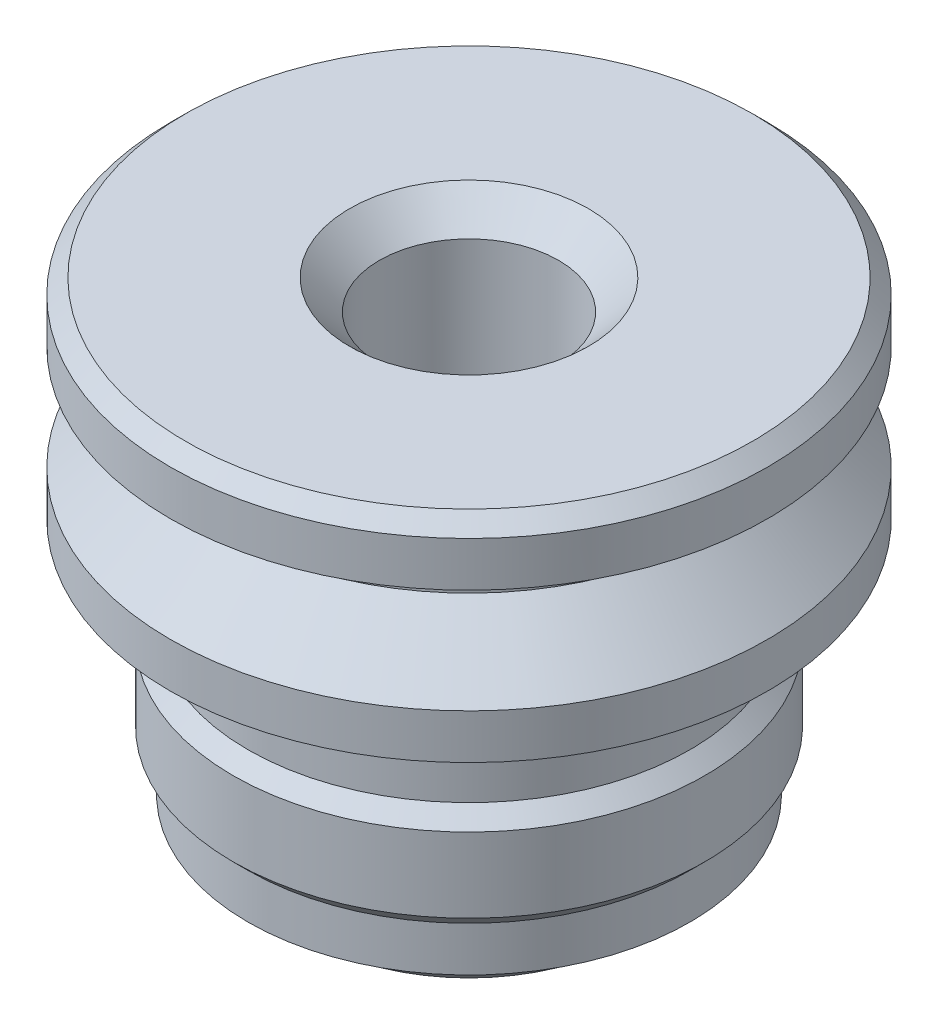
ISO-10303-21;
HEADER;
FILE_DESCRIPTION(('STEP AP214'),'2;1');
FILE_NAME('part.step','',(''),(''),'','','');
FILE_SCHEMA(('AUTOMOTIVE_DESIGN { 1 0 10303 214 1 1 1 1 }'));
ENDSEC;
DATA;
#1=APPLICATION_CONTEXT('core data for automotive mechanical design processes');
#2=APPLICATION_PROTOCOL_DEFINITION('international standard','automotive_design',2000,#1);
#3=PRODUCT_CONTEXT('',#1,'mechanical');
#4=PRODUCT('Part','Part','',(#3));
#5=PRODUCT_RELATED_PRODUCT_CATEGORY('part','',(#4));
#6=PRODUCT_DEFINITION_FORMATION('','',#4);
#7=PRODUCT_DEFINITION_CONTEXT('part definition',#1,'design');
#8=PRODUCT_DEFINITION('design','',#6,#7);
#9=PRODUCT_DEFINITION_SHAPE('','',#8);
#10=(LENGTH_UNIT() NAMED_UNIT(*) SI_UNIT(.MILLI.,.METRE.));
#11=(NAMED_UNIT(*) PLANE_ANGLE_UNIT() SI_UNIT($,.RADIAN.));
#12=(NAMED_UNIT(*) SI_UNIT($,.STERADIAN.) SOLID_ANGLE_UNIT());
#13=UNCERTAINTY_MEASURE_WITH_UNIT(LENGTH_MEASURE(1.E-05),#10,'distance_accuracy_value','');
#14=(GEOMETRIC_REPRESENTATION_CONTEXT(3) GLOBAL_UNCERTAINTY_ASSIGNED_CONTEXT((#13)) GLOBAL_UNIT_ASSIGNED_CONTEXT((#10,
#11,#12)) REPRESENTATION_CONTEXT('',''));
#15=CARTESIAN_POINT('',(0.,0.,0.));
#16=DIRECTION('',(0.,0.,1.));
#17=DIRECTION('',(1.,0.,0.));
#18=AXIS2_PLACEMENT_3D('',#15,#16,#17);
#19=CARTESIAN_POINT('',(0.,0.,0.));
#20=DIRECTION('',(0.,1.,0.));
#21=DIRECTION('',(0.,0.,1.));
#22=AXIS2_PLACEMENT_3D('',#19,#20,#21);
#23=CYLINDRICAL_SURFACE('',#22,10.);
#24=CARTESIAN_POINT('',(0.,-0.500000000000002,0.));
#25=DIRECTION('',(0.,-1.,0.));
#26=DIRECTION('',(0.,0.,-1.));
#27=AXIS2_PLACEMENT_3D('',#24,#25,#26);
#28=CIRCLE('',#27,10.);
#29=CARTESIAN_POINT('',(0.,-0.500000000000002,-10.));
#30=VERTEX_POINT('',#29);
#31=EDGE_CURVE('E42',#30,#30,#28,.T.);
#32=ORIENTED_EDGE('',*,*,#31,.T.);
#33=EDGE_LOOP('',(#32));
#34=FACE_BOUND('',#33,.T.);
#35=CARTESIAN_POINT('',(0.,-2.,0.));
#36=DIRECTION('',(0.,1.,0.));
#37=DIRECTION('',(0.,0.,1.));
#38=AXIS2_PLACEMENT_3D('',#35,#36,#37);
#39=CIRCLE('',#38,10.);
#40=CARTESIAN_POINT('',(0.,-2.,10.));
#41=VERTEX_POINT('',#40);
#42=EDGE_CURVE('E57',#41,#41,#39,.T.);
#43=ORIENTED_EDGE('',*,*,#42,.T.);
#44=EDGE_LOOP('',(#43));
#45=FACE_BOUND('',#44,.T.);
#46=ADVANCED_FACE('F31',(#34,#45),#23,.T.);
#47=CARTESIAN_POINT('',(0.,-2.,-10.));
#48=DIRECTION('',(0.,1.,0.));
#49=DIRECTION('',(0.,0.,1.));
#50=AXIS2_PLACEMENT_3D('',#47,#48,#49);
#51=PLANE('',#50);
#52=ORIENTED_EDGE('',*,*,#42,.F.);
#53=EDGE_LOOP('',(#52));
#54=FACE_BOUND('',#53,.T.);
#55=CARTESIAN_POINT('',(0.,-2.,0.));
#56=DIRECTION('',(0.,1.,0.));
#57=DIRECTION('',(0.,0.,1.));
#58=AXIS2_PLACEMENT_3D('',#55,#56,#57);
#59=CIRCLE('',#58,8.);
#60=CARTESIAN_POINT('',(0.,-2.,8.));
#61=VERTEX_POINT('',#60);
#62=EDGE_CURVE('E60',#61,#61,#59,.T.);
#63=ORIENTED_EDGE('',*,*,#62,.T.);
#64=EDGE_LOOP('',(#63));
#65=FACE_BOUND('',#64,.T.);
#66=ADVANCED_FACE('F113',(#54,#65),#51,.F.);
#67=CARTESIAN_POINT('',(0.,0.,0.));
#68=DIRECTION('',(0.,1.,0.));
#69=DIRECTION('',(0.,0.,1.));
#70=AXIS2_PLACEMENT_3D('',#67,#68,#69);
#71=CYLINDRICAL_SURFACE('',#70,8.);
#72=ORIENTED_EDGE('',*,*,#62,.F.);
#73=EDGE_LOOP('',(#72));
#74=FACE_BOUND('',#73,.T.);
#75=CARTESIAN_POINT('',(0.,-3.5,0.));
#76=DIRECTION('',(0.,1.,0.));
#77=DIRECTION('',(0.,0.,1.));
#78=AXIS2_PLACEMENT_3D('',#75,#76,#77);
#79=CIRCLE('',#78,8.);
#80=CARTESIAN_POINT('',(0.,-3.5,8.));
#81=VERTEX_POINT('',#80);
#82=EDGE_CURVE('E63',#81,#81,#79,.T.);
#83=ORIENTED_EDGE('',*,*,#82,.T.);
#84=EDGE_LOOP('',(#83));
#85=FACE_BOUND('',#84,.T.);
#86=ADVANCED_FACE('F119',(#74,#85),#71,.T.);
#87=CARTESIAN_POINT('',(0.,-5.5,0.));
#88=DIRECTION('',(0.,-1.,0.));
#89=DIRECTION('',(0.,0.,-1.));
#90=AXIS2_PLACEMENT_3D('',#87,#88,#89);
#91=CONICAL_SURFACE('',#90,10.,0.785398163397448);
#92=ORIENTED_EDGE('',*,*,#82,.F.);
#93=EDGE_LOOP('',(#92));
#94=FACE_BOUND('',#93,.T.);
#95=CARTESIAN_POINT('',(0.,-5.5,0.));
#96=DIRECTION('',(0.,1.,0.));
#97=DIRECTION('',(0.,0.,1.));
#98=AXIS2_PLACEMENT_3D('',#95,#96,#97);
#99=CIRCLE('',#98,10.);
#100=CARTESIAN_POINT('',(0.,-5.5,10.));
#101=VERTEX_POINT('',#100);
#102=EDGE_CURVE('E66',#101,#101,#99,.T.);
#103=ORIENTED_EDGE('',*,*,#102,.T.);
#104=EDGE_LOOP('',(#103));
#105=FACE_BOUND('',#104,.T.);
#106=ADVANCED_FACE('F261',(#94,#105),#91,.T.);
#107=CARTESIAN_POINT('',(0.,0.,0.));
#108=DIRECTION('',(0.,1.,0.));
#109=DIRECTION('',(0.,0.,1.));
#110=AXIS2_PLACEMENT_3D('',#107,#108,#109);
#111=CYLINDRICAL_SURFACE('',#110,10.);
#112=ORIENTED_EDGE('',*,*,#102,.F.);
#113=EDGE_LOOP('',(#112));
#114=FACE_BOUND('',#113,.T.);
#115=CARTESIAN_POINT('',(0.,-7.,0.));
#116=DIRECTION('',(0.,1.,0.));
#117=DIRECTION('',(0.,0.,1.));
#118=AXIS2_PLACEMENT_3D('',#115,#116,#117);
#119=CIRCLE('',#118,10.);
#120=CARTESIAN_POINT('',(0.,-7.,10.));
#121=VERTEX_POINT('',#120);
#122=EDGE_CURVE('E69',#121,#121,#119,.T.);
#123=ORIENTED_EDGE('',*,*,#122,.T.);
#124=EDGE_LOOP('',(#123));
#125=FACE_BOUND('',#124,.T.);
#126=ADVANCED_FACE('F251',(#114,#125),#111,.T.);
#127=CARTESIAN_POINT('',(0.,-7.,-10.));
#128=DIRECTION('',(0.,1.,0.));
#129=DIRECTION('',(0.,0.,1.));
#130=AXIS2_PLACEMENT_3D('',#127,#128,#129);
#131=PLANE('',#130);
#132=ORIENTED_EDGE('',*,*,#122,.F.);
#133=EDGE_LOOP('',(#132));
#134=FACE_BOUND('',#133,.T.);
#135=CARTESIAN_POINT('',(0.,-7.,0.));
#136=DIRECTION('',(0.,1.,0.));
#137=DIRECTION('',(0.,0.,1.));
#138=AXIS2_PLACEMENT_3D('',#135,#136,#137);
#139=CIRCLE('',#138,7.4);
#140=CARTESIAN_POINT('',(0.,-7.,7.4));
#141=VERTEX_POINT('',#140);
#142=EDGE_CURVE('E72',#141,#141,#139,.T.);
#143=ORIENTED_EDGE('',*,*,#142,.T.);
#144=EDGE_LOOP('',(#143));
#145=FACE_BOUND('',#144,.T.);
#146=ADVANCED_FACE('F241',(#134,#145),#131,.F.);
#147=CARTESIAN_POINT('',(0.,0.,0.));
#148=DIRECTION('',(0.,1.,0.));
#149=DIRECTION('',(0.,0.,1.));
#150=AXIS2_PLACEMENT_3D('',#147,#148,#149);
#151=CYLINDRICAL_SURFACE('',#150,7.4);
#152=ORIENTED_EDGE('',*,*,#142,.F.);
#153=EDGE_LOOP('',(#152));
#154=FACE_BOUND('',#153,.T.);
#155=CARTESIAN_POINT('',(0.,-10.,0.));
#156=DIRECTION('',(0.,1.,0.));
#157=DIRECTION('',(0.,0.,1.));
#158=AXIS2_PLACEMENT_3D('',#155,#156,#157);
#159=CIRCLE('',#158,7.4);
#160=CARTESIAN_POINT('',(0.,-10.,7.4));
#161=VERTEX_POINT('',#160);
#162=EDGE_CURVE('E75',#161,#161,#159,.T.);
#163=ORIENTED_EDGE('',*,*,#162,.T.);
#164=EDGE_LOOP('',(#163));
#165=FACE_BOUND('',#164,.T.);
#166=ADVANCED_FACE('F231',(#154,#165),#151,.T.);
#167=CARTESIAN_POINT('',(0.,-10.5,0.));
#168=DIRECTION('',(0.,-1.,0.));
#169=DIRECTION('',(0.,0.,-1.));
#170=AXIS2_PLACEMENT_3D('',#167,#168,#169);
#171=CONICAL_SURFACE('',#170,7.9,0.785398163397452);
#172=ORIENTED_EDGE('',*,*,#162,.F.);
#173=EDGE_LOOP('',(#172));
#174=FACE_BOUND('',#173,.T.);
#175=CARTESIAN_POINT('',(0.,-10.5,0.));
#176=DIRECTION('',(0.,1.,0.));
#177=DIRECTION('',(0.,0.,1.));
#178=AXIS2_PLACEMENT_3D('',#175,#176,#177);
#179=CIRCLE('',#178,7.9);
#180=CARTESIAN_POINT('',(0.,-10.5,7.9));
#181=VERTEX_POINT('',#180);
#182=EDGE_CURVE('E78',#181,#181,#179,.T.);
#183=ORIENTED_EDGE('',*,*,#182,.T.);
#184=EDGE_LOOP('',(#183));
#185=FACE_BOUND('',#184,.T.);
#186=ADVANCED_FACE('F221',(#174,#185),#171,.T.);
#187=CARTESIAN_POINT('',(0.,0.,0.));
#188=DIRECTION('',(0.,1.,0.));
#189=DIRECTION('',(0.,0.,1.));
#190=AXIS2_PLACEMENT_3D('',#187,#188,#189);
#191=CYLINDRICAL_SURFACE('',#190,7.9);
#192=ORIENTED_EDGE('',*,*,#182,.F.);
#193=EDGE_LOOP('',(#192));
#194=FACE_BOUND('',#193,.T.);
#195=CARTESIAN_POINT('',(0.,-13.,0.));
#196=DIRECTION('',(0.,1.,0.));
#197=DIRECTION('',(0.,0.,1.));
#198=AXIS2_PLACEMENT_3D('',#195,#196,#197);
#199=CIRCLE('',#198,7.9);
#200=CARTESIAN_POINT('',(0.,-13.,7.9));
#201=VERTEX_POINT('',#200);
#202=EDGE_CURVE('E81',#201,#201,#199,.T.);
#203=ORIENTED_EDGE('',*,*,#202,.T.);
#204=EDGE_LOOP('',(#203));
#205=FACE_BOUND('',#204,.T.);
#206=ADVANCED_FACE('F211',(#194,#205),#191,.T.);
#207=CARTESIAN_POINT('',(0.,-13.5,0.));
#208=DIRECTION('',(0.,1.,0.));
#209=DIRECTION('',(0.,0.,1.));
#210=AXIS2_PLACEMENT_3D('',#207,#208,#209);
#211=CONICAL_SURFACE('',#210,7.4,0.785398163397452);
#212=ORIENTED_EDGE('',*,*,#202,.F.);
#213=EDGE_LOOP('',(#212));
#214=FACE_BOUND('',#213,.T.);
#215=CARTESIAN_POINT('',(0.,-13.5,0.));
#216=DIRECTION('',(0.,1.,0.));
#217=DIRECTION('',(0.,0.,1.));
#218=AXIS2_PLACEMENT_3D('',#215,#216,#217);
#219=CIRCLE('',#218,7.4);
#220=CARTESIAN_POINT('',(0.,-13.5,7.4));
#221=VERTEX_POINT('',#220);
#222=EDGE_CURVE('E84',#221,#221,#219,.T.);
#223=ORIENTED_EDGE('',*,*,#222,.T.);
#224=EDGE_LOOP('',(#223));
#225=FACE_BOUND('',#224,.T.);
#226=ADVANCED_FACE('F201',(#214,#225),#211,.T.);
#227=CARTESIAN_POINT('',(0.,0.,0.));
#228=DIRECTION('',(0.,1.,0.));
#229=DIRECTION('',(0.,0.,1.));
#230=AXIS2_PLACEMENT_3D('',#227,#228,#229);
#231=CYLINDRICAL_SURFACE('',#230,7.4);
#232=ORIENTED_EDGE('',*,*,#222,.F.);
#233=EDGE_LOOP('',(#232));
#234=FACE_BOUND('',#233,.T.);
#235=CARTESIAN_POINT('',(0.,-15.,0.));
#236=DIRECTION('',(0.,1.,0.));
#237=DIRECTION('',(0.,0.,1.));
#238=AXIS2_PLACEMENT_3D('',#235,#236,#237);
#239=CIRCLE('',#238,7.4);
#240=CARTESIAN_POINT('',(0.,-15.,7.4));
#241=VERTEX_POINT('',#240);
#242=EDGE_CURVE('E87',#241,#241,#239,.T.);
#243=ORIENTED_EDGE('',*,*,#242,.T.);
#244=EDGE_LOOP('',(#243));
#245=FACE_BOUND('',#244,.T.);
#246=ADVANCED_FACE('F191',(#234,#245),#231,.T.);
#247=CARTESIAN_POINT('',(0.,-15.,-7.4));
#248=DIRECTION('',(0.,1.,0.));
#249=DIRECTION('',(0.,0.,1.));
#250=AXIS2_PLACEMENT_3D('',#247,#248,#249);
#251=PLANE('',#250);
#252=ORIENTED_EDGE('',*,*,#242,.F.);
#253=EDGE_LOOP('',(#252));
#254=FACE_BOUND('',#253,.T.);
#255=CARTESIAN_POINT('',(0.,-15.,0.));
#256=DIRECTION('',(0.,1.,0.));
#257=DIRECTION('',(0.,0.,1.));
#258=AXIS2_PLACEMENT_3D('',#255,#256,#257);
#259=CIRCLE('',#258,5.9);
#260=CARTESIAN_POINT('',(0.,-15.,5.9));
#261=VERTEX_POINT('',#260);
#262=EDGE_CURVE('E90',#261,#261,#259,.T.);
#263=ORIENTED_EDGE('',*,*,#262,.T.);
#264=EDGE_LOOP('',(#263));
#265=FACE_BOUND('',#264,.T.);
#266=ADVANCED_FACE('F175',(#254,#265),#251,.F.);
#267=CARTESIAN_POINT('',(0.,0.,0.));
#268=DIRECTION('',(0.,1.,0.));
#269=DIRECTION('',(0.,0.,1.));
#270=AXIS2_PLACEMENT_3D('',#267,#268,#269);
#271=CYLINDRICAL_SURFACE('',#270,5.9);
#272=CARTESIAN_POINT('',(0.,-16.,0.));
#273=DIRECTION('',(0.,1.,0.));
#274=DIRECTION('',(0.,0.,1.));
#275=AXIS2_PLACEMENT_3D('',#272,#273,#274);
#276=CIRCLE('',#275,5.9);
#277=CARTESIAN_POINT('',(0.,-16.,5.9));
#278=VERTEX_POINT('',#277);
#279=EDGE_CURVE('E54',#278,#278,#276,.T.);
#280=ORIENTED_EDGE('',*,*,#279,.T.);
#281=EDGE_LOOP('',(#280));
#282=FACE_BOUND('',#281,.T.);
#283=ORIENTED_EDGE('',*,*,#262,.F.);
#284=EDGE_LOOP('',(#283));
#285=FACE_BOUND('',#284,.T.);
#286=ADVANCED_FACE('F109',(#282,#285),#271,.T.);
#287=CARTESIAN_POINT('',(0.,-16.5,-5.9));
#288=DIRECTION('',(0.,1.,0.));
#289=DIRECTION('',(0.,0.,1.));
#290=AXIS2_PLACEMENT_3D('',#287,#288,#289);
#291=PLANE('',#290);
#292=CARTESIAN_POINT('',(0.,-16.5,0.));
#293=DIRECTION('',(0.,1.,0.));
#294=DIRECTION('',(0.,0.,1.));
#295=AXIS2_PLACEMENT_3D('',#292,#293,#294);
#296=CIRCLE('',#295,5.4);
#297=CARTESIAN_POINT('',(0.,-16.5,5.4));
#298=VERTEX_POINT('',#297);
#299=EDGE_CURVE('E51',#298,#298,#296,.F.);
#300=ORIENTED_EDGE('',*,*,#299,.T.);
#301=EDGE_LOOP('',(#300));
#302=FACE_BOUND('',#301,.T.);
#303=CARTESIAN_POINT('',(0.,-16.5,0.));
#304=DIRECTION('',(0.,1.,0.));
#305=DIRECTION('',(0.,0.,1.));
#306=AXIS2_PLACEMENT_3D('',#303,#304,#305);
#307=CIRCLE('',#306,3.);
#308=CARTESIAN_POINT('',(0.,-16.5,3.));
#309=VERTEX_POINT('',#308);
#310=EDGE_CURVE('E93',#309,#309,#307,.T.);
#311=ORIENTED_EDGE('',*,*,#310,.T.);
#312=EDGE_LOOP('',(#311));
#313=FACE_BOUND('',#312,.T.);
#314=ADVANCED_FACE('F97',(#302,#313),#291,.F.);
#315=CARTESIAN_POINT('',(0.,0.,0.));
#316=DIRECTION('',(0.,1.,0.));
#317=DIRECTION('',(0.,0.,1.));
#318=AXIS2_PLACEMENT_3D('',#315,#316,#317);
#319=CYLINDRICAL_SURFACE('',#318,3.);
#320=CARTESIAN_POINT('',(0.,-0.999999999999995,0.));
#321=DIRECTION('',(0.,-1.,0.));
#322=DIRECTION('',(0.,0.,-1.));
#323=AXIS2_PLACEMENT_3D('',#320,#321,#322);
#324=CIRCLE('',#323,3.);
#325=CARTESIAN_POINT('',(0.,-0.999999999999995,-3.));
#326=VERTEX_POINT('',#325);
#327=EDGE_CURVE('E38',#326,#326,#324,.F.);
#328=ORIENTED_EDGE('',*,*,#327,.T.);
#329=EDGE_LOOP('',(#328));
#330=FACE_BOUND('',#329,.T.);
#331=ORIENTED_EDGE('',*,*,#310,.F.);
#332=EDGE_LOOP('',(#331));
#333=FACE_BOUND('',#332,.T.);
#334=ADVANCED_FACE('F99',(#330,#333),#319,.F.);
#335=CARTESIAN_POINT('',(0.,0.,-3.));
#336=DIRECTION('',(0.,-1.,0.));
#337=DIRECTION('',(0.,0.,-1.));
#338=AXIS2_PLACEMENT_3D('',#335,#336,#337);
#339=PLANE('',#338);
#340=CARTESIAN_POINT('',(0.,0.,0.));
#341=DIRECTION('',(0.,-1.,0.));
#342=DIRECTION('',(0.,0.,-1.));
#343=AXIS2_PLACEMENT_3D('',#340,#341,#342);
#344=CIRCLE('',#343,4.);
#345=CARTESIAN_POINT('',(0.,0.,-4.));
#346=VERTEX_POINT('',#345);
#347=EDGE_CURVE('E10',#346,#346,#344,.T.);
#348=ORIENTED_EDGE('',*,*,#347,.T.);
#349=EDGE_LOOP('',(#348));
#350=FACE_BOUND('',#349,.T.);
#351=CARTESIAN_POINT('',(0.,0.,0.));
#352=DIRECTION('',(0.,-1.,0.));
#353=DIRECTION('',(0.,0.,-1.));
#354=AXIS2_PLACEMENT_3D('',#351,#352,#353);
#355=CIRCLE('',#354,9.5);
#356=CARTESIAN_POINT('',(0.,0.,-9.5));
#357=VERTEX_POINT('',#356);
#358=EDGE_CURVE('E46',#357,#357,#355,.F.);
#359=ORIENTED_EDGE('',*,*,#358,.T.);
#360=EDGE_LOOP('',(#359));
#361=FACE_BOUND('',#360,.T.);
#362=ADVANCED_FACE('F101',(#350,#361),#339,.F.);
#363=CARTESIAN_POINT('',(0.,-16.,0.));
#364=DIRECTION('',(0.,1.,0.));
#365=DIRECTION('',(0.,0.,1.));
#366=AXIS2_PLACEMENT_3D('',#363,#364,#365);
#367=CONICAL_SURFACE('',#366,5.9,0.785398163397451);
#368=ORIENTED_EDGE('',*,*,#299,.F.);
#369=EDGE_LOOP('',(#368));
#370=FACE_BOUND('',#369,.T.);
#371=ORIENTED_EDGE('',*,*,#279,.F.);
#372=EDGE_LOOP('',(#371));
#373=FACE_BOUND('',#372,.T.);
#374=ADVANCED_FACE('F107',(#370,#373),#367,.T.);
#375=CARTESIAN_POINT('',(0.,0.,0.));
#376=DIRECTION('',(0.,-1.,0.));
#377=DIRECTION('',(0.,0.,-1.));
#378=AXIS2_PLACEMENT_3D('',#375,#376,#377);
#379=CONICAL_SURFACE('',#378,9.5,0.785398163397448);
#380=ORIENTED_EDGE('',*,*,#31,.F.);
#381=EDGE_LOOP('',(#380));
#382=FACE_BOUND('',#381,.T.);
#383=ORIENTED_EDGE('',*,*,#358,.F.);
#384=EDGE_LOOP('',(#383));
#385=FACE_BOUND('',#384,.T.);
#386=ADVANCED_FACE('F126',(#382,#385),#379,.T.);
#387=CARTESIAN_POINT('',(0.,-0.999999999999995,0.));
#388=DIRECTION('',(0.,1.,0.));
#389=DIRECTION('',(0.,0.,1.));
#390=AXIS2_PLACEMENT_3D('',#387,#388,#389);
#391=CONICAL_SURFACE('',#390,3.,0.78539816339745);
#392=ORIENTED_EDGE('',*,*,#347,.F.);
#393=EDGE_LOOP('',(#392));
#394=FACE_BOUND('',#393,.T.);
#395=ORIENTED_EDGE('',*,*,#327,.F.);
#396=EDGE_LOOP('',(#395));
#397=FACE_BOUND('',#396,.T.);
#398=ADVANCED_FACE('F33',(#394,#397),#391,.F.);
#399=CLOSED_SHELL('',(#46,#66,#86,#106,#126,#146,#166,#186,#206,#226,#246,#266,#286,#314,#334,
#362,#374,#386,#398));
#400=MANIFOLD_SOLID_BREP('B2',#399);
#401=ADVANCED_BREP_SHAPE_REPRESENTATION('',(#18,#400),#14);
#402=SHAPE_DEFINITION_REPRESENTATION(#9,#401);
ENDSEC;
END-ISO-10303-21;
